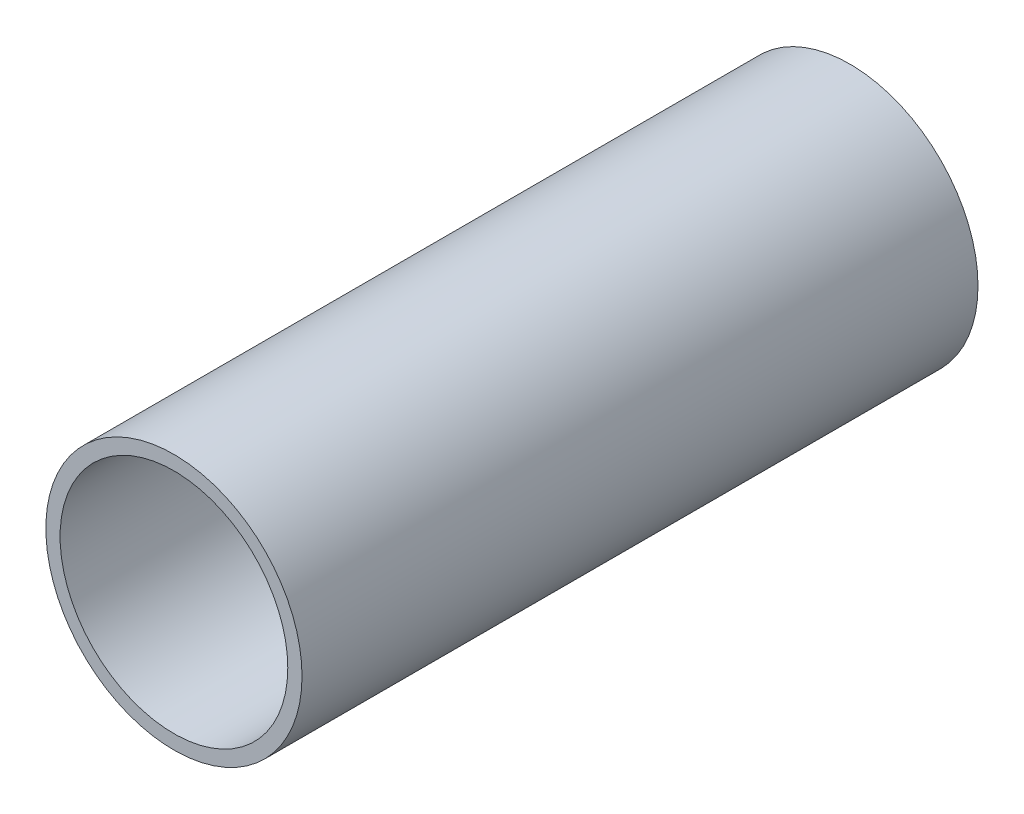
ISO-10303-21;
HEADER;
FILE_DESCRIPTION(('STEP AP214'),'2;1');
FILE_NAME('part.step','',(''),(''),'','','');
FILE_SCHEMA(('AUTOMOTIVE_DESIGN { 1 0 10303 214 1 1 1 1 }'));
ENDSEC;
DATA;
#1=APPLICATION_CONTEXT('core data for automotive mechanical design processes');
#2=APPLICATION_PROTOCOL_DEFINITION('international standard','automotive_design',2000,#1);
#3=PRODUCT_CONTEXT('',#1,'mechanical');
#4=PRODUCT('Part','Part','',(#3));
#5=PRODUCT_RELATED_PRODUCT_CATEGORY('part','',(#4));
#6=PRODUCT_DEFINITION_FORMATION('','',#4);
#7=PRODUCT_DEFINITION_CONTEXT('part definition',#1,'design');
#8=PRODUCT_DEFINITION('design','',#6,#7);
#9=PRODUCT_DEFINITION_SHAPE('','',#8);
#10=(LENGTH_UNIT() NAMED_UNIT(*) SI_UNIT(.MILLI.,.METRE.));
#11=(NAMED_UNIT(*) PLANE_ANGLE_UNIT() SI_UNIT($,.RADIAN.));
#12=(NAMED_UNIT(*) SI_UNIT($,.STERADIAN.) SOLID_ANGLE_UNIT());
#13=UNCERTAINTY_MEASURE_WITH_UNIT(LENGTH_MEASURE(1.E-05),#10,'distance_accuracy_value','');
#14=(GEOMETRIC_REPRESENTATION_CONTEXT(3) GLOBAL_UNCERTAINTY_ASSIGNED_CONTEXT((#13)) GLOBAL_UNIT_ASSIGNED_CONTEXT((#10,
#11,#12)) REPRESENTATION_CONTEXT('',''));
#15=CARTESIAN_POINT('',(0.,0.,0.));
#16=DIRECTION('',(0.,0.,1.));
#17=DIRECTION('',(1.,0.,0.));
#18=AXIS2_PLACEMENT_3D('',#15,#16,#17);
#19=CARTESIAN_POINT('',(0.,0.,150.8125));
#20=DIRECTION('',(0.,0.,-1.));
#21=DIRECTION('',(-1.,0.,0.));
#22=AXIS2_PLACEMENT_3D('',#19,#20,#21);
#23=CYLINDRICAL_SURFACE('',#22,57.15);
#24=CARTESIAN_POINT('',(0.,0.,150.8125));
#25=DIRECTION('',(0.,0.,1.));
#26=DIRECTION('',(1.,0.,0.));
#27=AXIS2_PLACEMENT_3D('',#24,#25,#26);
#28=CIRCLE('',#27,57.15);
#29=CARTESIAN_POINT('',(57.15,0.,150.8125));
#30=VERTEX_POINT('',#29);
#31=EDGE_CURVE('E10',#30,#30,#28,.T.);
#32=ORIENTED_EDGE('',*,*,#31,.F.);
#33=EDGE_LOOP('',(#32));
#34=FACE_BOUND('',#33,.T.);
#35=CARTESIAN_POINT('',(0.,0.,-150.8125));
#36=DIRECTION('',(0.,0.,1.));
#37=DIRECTION('',(1.,0.,0.));
#38=AXIS2_PLACEMENT_3D('',#35,#36,#37);
#39=CIRCLE('',#38,57.15);
#40=CARTESIAN_POINT('',(57.15,0.,-150.8125));
#41=VERTEX_POINT('',#40);
#42=EDGE_CURVE('E50',#41,#41,#39,.T.);
#43=ORIENTED_EDGE('',*,*,#42,.T.);
#44=EDGE_LOOP('',(#43));
#45=FACE_BOUND('',#44,.T.);
#46=ADVANCED_FACE('F47',(#34,#45),#23,.T.);
#47=CARTESIAN_POINT('',(0.,0.,150.8125));
#48=DIRECTION('',(0.,0.,1.));
#49=DIRECTION('',(1.,0.,0.));
#50=AXIS2_PLACEMENT_3D('',#47,#48,#49);
#51=PLANE('',#50);
#52=CARTESIAN_POINT('',(0.,0.,150.8125));
#53=DIRECTION('',(0.,0.,1.));
#54=DIRECTION('',(1.,0.,0.));
#55=AXIS2_PLACEMENT_3D('',#52,#53,#54);
#56=CIRCLE('',#55,50.8);
#57=CARTESIAN_POINT('',(50.8,0.,150.8125));
#58=VERTEX_POINT('',#57);
#59=EDGE_CURVE('E61',#58,#58,#56,.T.);
#60=ORIENTED_EDGE('',*,*,#59,.F.);
#61=EDGE_LOOP('',(#60));
#62=FACE_BOUND('',#61,.T.);
#63=ORIENTED_EDGE('',*,*,#31,.T.);
#64=EDGE_LOOP('',(#63));
#65=FACE_BOUND('',#64,.T.);
#66=ADVANCED_FACE('F78',(#62,#65),#51,.T.);
#67=CARTESIAN_POINT('',(0.,0.,-150.8125));
#68=DIRECTION('',(0.,0.,1.));
#69=DIRECTION('',(1.,0.,0.));
#70=AXIS2_PLACEMENT_3D('',#67,#68,#69);
#71=PLANE('',#70);
#72=CARTESIAN_POINT('',(0.,0.,-150.8125));
#73=DIRECTION('',(0.,0.,1.));
#74=DIRECTION('',(1.,0.,0.));
#75=AXIS2_PLACEMENT_3D('',#72,#73,#74);
#76=CIRCLE('',#75,50.8);
#77=CARTESIAN_POINT('',(50.8,0.,-150.8125));
#78=VERTEX_POINT('',#77);
#79=EDGE_CURVE('E59',#78,#78,#76,.T.);
#80=ORIENTED_EDGE('',*,*,#79,.T.);
#81=EDGE_LOOP('',(#80));
#82=FACE_BOUND('',#81,.T.);
#83=ORIENTED_EDGE('',*,*,#42,.F.);
#84=EDGE_LOOP('',(#83));
#85=FACE_BOUND('',#84,.T.);
#86=ADVANCED_FACE('F69',(#82,#85),#71,.F.);
#87=CARTESIAN_POINT('',(0.,0.,-150.8125));
#88=DIRECTION('',(0.,0.,1.));
#89=DIRECTION('',(1.,0.,0.));
#90=AXIS2_PLACEMENT_3D('',#87,#88,#89);
#91=CYLINDRICAL_SURFACE('',#90,50.8);
#92=ORIENTED_EDGE('',*,*,#79,.F.);
#93=EDGE_LOOP('',(#92));
#94=FACE_BOUND('',#93,.T.);
#95=ORIENTED_EDGE('',*,*,#59,.T.);
#96=EDGE_LOOP('',(#95));
#97=FACE_BOUND('',#96,.T.);
#98=ADVANCED_FACE('F72',(#94,#97),#91,.F.);
#99=CLOSED_SHELL('',(#46,#66,#86,#98));
#100=MANIFOLD_SOLID_BREP('B2',#99);
#101=ADVANCED_BREP_SHAPE_REPRESENTATION('',(#18,#100),#14);
#102=SHAPE_DEFINITION_REPRESENTATION(#9,#101);
ENDSEC;
END-ISO-10303-21;
